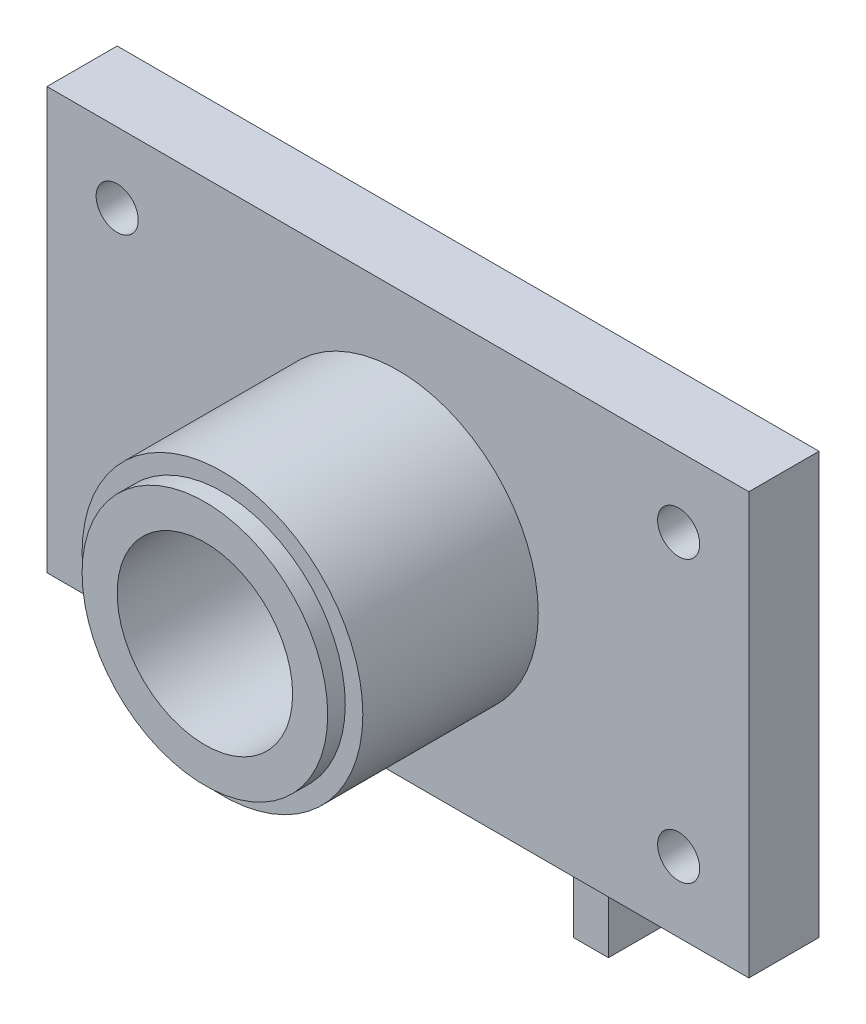
ISO-10303-21;
HEADER;
FILE_DESCRIPTION(('STEP AP214'),'2;1');
FILE_NAME('part.step','',(''),(''),'','','');
FILE_SCHEMA(('AUTOMOTIVE_DESIGN { 1 0 10303 214 1 1 1 1 }'));
ENDSEC;
DATA;
#1=APPLICATION_CONTEXT('core data for automotive mechanical design processes');
#2=APPLICATION_PROTOCOL_DEFINITION('international standard','automotive_design',2000,#1);
#3=PRODUCT_CONTEXT('',#1,'mechanical');
#4=PRODUCT('Part','Part','',(#3));
#5=PRODUCT_RELATED_PRODUCT_CATEGORY('part','',(#4));
#6=PRODUCT_DEFINITION_FORMATION('','',#4);
#7=PRODUCT_DEFINITION_CONTEXT('part definition',#1,'design');
#8=PRODUCT_DEFINITION('design','',#6,#7);
#9=PRODUCT_DEFINITION_SHAPE('','',#8);
#10=(LENGTH_UNIT() NAMED_UNIT(*) SI_UNIT(.MILLI.,.METRE.));
#11=(NAMED_UNIT(*) PLANE_ANGLE_UNIT() SI_UNIT($,.RADIAN.));
#12=(NAMED_UNIT(*) SI_UNIT($,.STERADIAN.) SOLID_ANGLE_UNIT());
#13=UNCERTAINTY_MEASURE_WITH_UNIT(LENGTH_MEASURE(1.E-05),#10,'distance_accuracy_value','');
#14=(GEOMETRIC_REPRESENTATION_CONTEXT(3) GLOBAL_UNCERTAINTY_ASSIGNED_CONTEXT((#13)) GLOBAL_UNIT_ASSIGNED_CONTEXT((#10,
#11,#12)) REPRESENTATION_CONTEXT('',''));
#15=CARTESIAN_POINT('',(0.,0.,0.));
#16=DIRECTION('',(0.,0.,1.));
#17=DIRECTION('',(1.,0.,0.));
#18=AXIS2_PLACEMENT_3D('',#15,#16,#17);
#19=CARTESIAN_POINT('',(0.,0.,20.));
#20=DIRECTION('',(0.,0.,1.));
#21=DIRECTION('',(1.,0.,0.));
#22=AXIS2_PLACEMENT_3D('',#19,#20,#21);
#23=PLANE('',#22);
#24=CARTESIAN_POINT('',(0.,0.,20.));
#25=DIRECTION('',(0.,0.,-1.));
#26=DIRECTION('',(1.,0.,0.));
#27=AXIS2_PLACEMENT_3D('',#24,#25,#26);
#28=CIRCLE('',#27,25.);
#29=CARTESIAN_POINT('',(25.,0.,20.));
#30=VERTEX_POINT('',#29);
#31=EDGE_CURVE('E25',#30,#30,#28,.T.);
#32=ORIENTED_EDGE('',*,*,#31,.F.);
#33=EDGE_LOOP('',(#32));
#34=FACE_BOUND('',#33,.T.);
#35=ADVANCED_FACE('F16',(#34),#23,.T.);
#36=CARTESIAN_POINT('',(0.,0.,0.));
#37=DIRECTION('',(0.,0.,-1.));
#38=DIRECTION('',(1.,0.,0.));
#39=AXIS2_PLACEMENT_3D('',#36,#37,#38);
#40=CYLINDRICAL_SURFACE('',#39,25.);
#41=ORIENTED_EDGE('',*,*,#31,.T.);
#42=DIRECTION('',(0.,0.,1.));
#43=VECTOR('',#42,1.);
#44=CARTESIAN_POINT('',(25.,0.,0.));
#45=LINE('',#44,#43);
#46=CARTESIAN_POINT('',(25.,0.,75.));
#47=VERTEX_POINT('',#46);
#48=EDGE_CURVE('E10',#30,#47,#45,.T.);
#49=ORIENTED_EDGE('',*,*,#48,.T.);
#50=CARTESIAN_POINT('',(0.,0.,75.));
#51=DIRECTION('',(0.,0.,-1.));
#52=DIRECTION('',(1.,0.,0.));
#53=AXIS2_PLACEMENT_3D('',#50,#51,#52);
#54=CIRCLE('',#53,25.);
#55=EDGE_CURVE('E186',#47,#47,#54,.T.);
#56=ORIENTED_EDGE('',*,*,#55,.F.);
#57=ORIENTED_EDGE('',*,*,#48,.F.);
#58=EDGE_LOOP('',(#41,#49,#56,#57));
#59=FACE_BOUND('',#58,.T.);
#60=ADVANCED_FACE('F18',(#59),#40,.F.);
#61=CARTESIAN_POINT('',(0.,0.,75.));
#62=DIRECTION('',(0.,0.,1.));
#63=DIRECTION('',(1.,0.,0.));
#64=AXIS2_PLACEMENT_3D('',#61,#62,#63);
#65=PLANE('',#64);
#66=ORIENTED_EDGE('',*,*,#55,.T.);
#67=EDGE_LOOP('',(#66));
#68=FACE_BOUND('',#67,.T.);
#69=CARTESIAN_POINT('',(0.,0.,75.));
#70=DIRECTION('',(0.,0.,1.));
#71=DIRECTION('',(1.,0.,0.));
#72=AXIS2_PLACEMENT_3D('',#69,#70,#71);
#73=CIRCLE('',#72,35.);
#74=CARTESIAN_POINT('',(35.,0.,75.));
#75=VERTEX_POINT('',#74);
#76=EDGE_CURVE('E180',#75,#75,#73,.T.);
#77=ORIENTED_EDGE('',*,*,#76,.T.);
#78=EDGE_LOOP('',(#77));
#79=FACE_BOUND('',#78,.T.);
#80=ADVANCED_FACE('F581',(#68,#79),#65,.T.);
#81=CARTESIAN_POINT('',(0.,0.,70.));
#82=DIRECTION('',(0.,0.,1.));
#83=DIRECTION('',(1.,0.,0.));
#84=AXIS2_PLACEMENT_3D('',#81,#82,#83);
#85=CYLINDRICAL_SURFACE('',#84,35.);
#86=CARTESIAN_POINT('',(0.,0.,70.));
#87=DIRECTION('',(0.,0.,1.));
#88=DIRECTION('',(1.,0.,0.));
#89=AXIS2_PLACEMENT_3D('',#86,#87,#88);
#90=CIRCLE('',#89,35.);
#91=CARTESIAN_POINT('',(35.,0.,70.));
#92=VERTEX_POINT('',#91);
#93=EDGE_CURVE('E179',#92,#92,#90,.T.);
#94=ORIENTED_EDGE('',*,*,#93,.T.);
#95=DIRECTION('',(0.,0.,1.));
#96=VECTOR('',#95,1.);
#97=CARTESIAN_POINT('',(35.,0.,70.));
#98=LINE('',#97,#96);
#99=EDGE_CURVE('E176',#92,#75,#98,.T.);
#100=ORIENTED_EDGE('',*,*,#99,.T.);
#101=ORIENTED_EDGE('',*,*,#76,.F.);
#102=ORIENTED_EDGE('',*,*,#99,.F.);
#103=EDGE_LOOP('',(#94,#100,#101,#102));
#104=FACE_BOUND('',#103,.T.);
#105=ADVANCED_FACE('F177',(#104),#85,.T.);
#106=CARTESIAN_POINT('',(0.,0.,70.));
#107=DIRECTION('',(0.,0.,1.));
#108=DIRECTION('',(1.,0.,0.));
#109=AXIS2_PLACEMENT_3D('',#106,#107,#108);
#110=PLANE('',#109);
#111=ORIENTED_EDGE('',*,*,#93,.F.);
#112=EDGE_LOOP('',(#111));
#113=FACE_BOUND('',#112,.T.);
#114=CARTESIAN_POINT('',(0.,0.,70.));
#115=DIRECTION('',(0.,0.,-1.));
#116=DIRECTION('',(1.,0.,0.));
#117=AXIS2_PLACEMENT_3D('',#114,#115,#116);
#118=CIRCLE('',#117,40.);
#119=CARTESIAN_POINT('',(40.,0.,70.));
#120=VERTEX_POINT('',#119);
#121=EDGE_CURVE('E189',#120,#120,#118,.T.);
#122=ORIENTED_EDGE('',*,*,#121,.F.);
#123=EDGE_LOOP('',(#122));
#124=FACE_BOUND('',#123,.T.);
#125=ADVANCED_FACE('F742',(#113,#124),#110,.T.);
#126=CARTESIAN_POINT('',(0.,0.,20.));
#127=DIRECTION('',(0.,0.,1.));
#128=DIRECTION('',(1.,0.,0.));
#129=AXIS2_PLACEMENT_3D('',#126,#127,#128);
#130=CYLINDRICAL_SURFACE('',#129,40.);
#131=DIRECTION('',(0.,0.,1.));
#132=VECTOR('',#131,1.);
#133=CARTESIAN_POINT('',(40.,0.,20.));
#134=LINE('',#133,#132);
#135=CARTESIAN_POINT('',(40.,0.,20.));
#136=VERTEX_POINT('',#135);
#137=EDGE_CURVE('E221',#136,#120,#134,.T.);
#138=ORIENTED_EDGE('',*,*,#137,.F.);
#139=CARTESIAN_POINT('',(0.,0.,20.));
#140=DIRECTION('',(0.,0.,-1.));
#141=DIRECTION('',(1.,0.,0.));
#142=AXIS2_PLACEMENT_3D('',#139,#140,#141);
#143=CIRCLE('',#142,40.);
#144=EDGE_CURVE('E213',#136,#136,#143,.T.);
#145=ORIENTED_EDGE('',*,*,#144,.F.);
#146=ORIENTED_EDGE('',*,*,#137,.T.);
#147=ORIENTED_EDGE('',*,*,#121,.T.);
#148=EDGE_LOOP('',(#138,#145,#146,#147));
#149=FACE_BOUND('',#148,.T.);
#150=ADVANCED_FACE('F609',(#149),#130,.T.);
#151=CARTESIAN_POINT('',(0.,0.,20.));
#152=DIRECTION('',(0.,0.,1.));
#153=DIRECTION('',(1.,0.,0.));
#154=AXIS2_PLACEMENT_3D('',#151,#152,#153);
#155=PLANE('',#154);
#156=ORIENTED_EDGE('',*,*,#144,.T.);
#157=EDGE_LOOP('',(#156));
#158=FACE_BOUND('',#157,.T.);
#159=CARTESIAN_POINT('',(80.,40.,20.));
#160=DIRECTION('',(0.,0.,-1.));
#161=DIRECTION('',(1.,0.,0.));
#162=AXIS2_PLACEMENT_3D('',#159,#160,#161);
#163=CIRCLE('',#162,6.);
#164=CARTESIAN_POINT('',(86.,40.,20.));
#165=VERTEX_POINT('',#164);
#166=EDGE_CURVE('E278',#165,#165,#163,.T.);
#167=ORIENTED_EDGE('',*,*,#166,.T.);
#168=EDGE_LOOP('',(#167));
#169=FACE_BOUND('',#168,.T.);
#170=CARTESIAN_POINT('',(-80.,40.,20.));
#171=DIRECTION('',(0.,0.,-1.));
#172=DIRECTION('',(1.,0.,0.));
#173=AXIS2_PLACEMENT_3D('',#170,#171,#172);
#174=CIRCLE('',#173,6.);
#175=CARTESIAN_POINT('',(-74.,40.,20.));
#176=VERTEX_POINT('',#175);
#177=EDGE_CURVE('E274',#176,#176,#174,.T.);
#178=ORIENTED_EDGE('',*,*,#177,.T.);
#179=EDGE_LOOP('',(#178));
#180=FACE_BOUND('',#179,.T.);
#181=CARTESIAN_POINT('',(80.,-40.,20.));
#182=DIRECTION('',(0.,0.,-1.));
#183=DIRECTION('',(1.,0.,0.));
#184=AXIS2_PLACEMENT_3D('',#181,#182,#183);
#185=CIRCLE('',#184,6.);
#186=CARTESIAN_POINT('',(86.,-40.,20.));
#187=VERTEX_POINT('',#186);
#188=EDGE_CURVE('E329',#187,#187,#185,.T.);
#189=ORIENTED_EDGE('',*,*,#188,.T.);
#190=EDGE_LOOP('',(#189));
#191=FACE_BOUND('',#190,.T.);
#192=CARTESIAN_POINT('',(-80.,-40.,20.));
#193=DIRECTION('',(0.,0.,-1.));
#194=DIRECTION('',(1.,0.,0.));
#195=AXIS2_PLACEMENT_3D('',#192,#193,#194);
#196=CIRCLE('',#195,6.);
#197=CARTESIAN_POINT('',(-74.,-40.,20.));
#198=VERTEX_POINT('',#197);
#199=EDGE_CURVE('E270',#198,#198,#196,.T.);
#200=ORIENTED_EDGE('',*,*,#199,.T.);
#201=EDGE_LOOP('',(#200));
#202=FACE_BOUND('',#201,.T.);
#203=DIRECTION('',(1.,0.,0.));
#204=VECTOR('',#203,1.);
#205=CARTESIAN_POINT('',(-100.,-60.,20.));
#206=LINE('',#205,#204);
#207=CARTESIAN_POINT('',(-100.,-60.,20.));
#208=VERTEX_POINT('',#207);
#209=CARTESIAN_POINT('',(100.,-60.,20.));
#210=VERTEX_POINT('',#209);
#211=EDGE_CURVE('E236',#208,#210,#206,.T.);
#212=ORIENTED_EDGE('',*,*,#211,.T.);
#213=DIRECTION('',(0.,1.,0.));
#214=VECTOR('',#213,1.);
#215=CARTESIAN_POINT('',(100.,-60.,20.));
#216=LINE('',#215,#214);
#217=CARTESIAN_POINT('',(100.,60.,20.));
#218=VERTEX_POINT('',#217);
#219=EDGE_CURVE('E408',#210,#218,#216,.T.);
#220=ORIENTED_EDGE('',*,*,#219,.T.);
#221=DIRECTION('',(-1.,0.,0.));
#222=VECTOR('',#221,1.);
#223=CARTESIAN_POINT('',(100.,60.,20.));
#224=LINE('',#223,#222);
#225=CARTESIAN_POINT('',(-100.,60.,20.));
#226=VERTEX_POINT('',#225);
#227=EDGE_CURVE('E263',#218,#226,#224,.T.);
#228=ORIENTED_EDGE('',*,*,#227,.T.);
#229=DIRECTION('',(0.,-1.,0.));
#230=VECTOR('',#229,1.);
#231=CARTESIAN_POINT('',(-100.,60.,20.));
#232=LINE('',#231,#230);
#233=EDGE_CURVE('E244',#226,#208,#232,.T.);
#234=ORIENTED_EDGE('',*,*,#233,.T.);
#235=EDGE_LOOP('',(#212,#220,#228,#234));
#236=FACE_BOUND('',#235,.T.);
#237=ADVANCED_FACE('F541',(#158,#169,#180,#191,#202,#236),#155,.T.);
#238=CARTESIAN_POINT('',(55.,0.,15.));
#239=DIRECTION('',(0.,0.,-1.));
#240=DIRECTION('',(0.,-1.,0.));
#241=AXIS2_PLACEMENT_3D('',#238,#239,#240);
#242=PLANE('',#241);
#243=DIRECTION('',(0.,-1.,0.));
#244=VECTOR('',#243,1.);
#245=CARTESIAN_POINT('',(45.,0.,15.));
#246=LINE('',#245,#244);
#247=CARTESIAN_POINT('',(45.,-60.,15.));
#248=VERTEX_POINT('',#247);
#249=CARTESIAN_POINT('',(45.,-80.,15.));
#250=VERTEX_POINT('',#249);
#251=EDGE_CURVE('E334',#248,#250,#246,.T.);
#252=ORIENTED_EDGE('',*,*,#251,.T.);
#253=DIRECTION('',(-1.,0.,0.));
#254=VECTOR('',#253,1.);
#255=CARTESIAN_POINT('',(55.,-80.,15.));
#256=LINE('',#255,#254);
#257=CARTESIAN_POINT('',(55.,-80.,15.));
#258=VERTEX_POINT('',#257);
#259=EDGE_CURVE('E211',#258,#250,#256,.T.);
#260=ORIENTED_EDGE('',*,*,#259,.F.);
#261=DIRECTION('',(0.,-1.,0.));
#262=VECTOR('',#261,1.);
#263=CARTESIAN_POINT('',(55.,0.,15.));
#264=LINE('',#263,#262);
#265=CARTESIAN_POINT('',(55.,-60.,15.));
#266=VERTEX_POINT('',#265);
#267=EDGE_CURVE('E235',#266,#258,#264,.T.);
#268=ORIENTED_EDGE('',*,*,#267,.F.);
#269=DIRECTION('',(-1.,0.,0.));
#270=VECTOR('',#269,1.);
#271=CARTESIAN_POINT('',(-22.5,-60.,15.));
#272=LINE('',#271,#270);
#273=EDGE_CURVE('E424',#266,#248,#272,.T.);
#274=ORIENTED_EDGE('',*,*,#273,.T.);
#275=EDGE_LOOP('',(#252,#260,#268,#274));
#276=FACE_BOUND('',#275,.T.);
#277=ADVANCED_FACE('F443',(#276),#242,.F.);
#278=CARTESIAN_POINT('',(50.,-80.,0.));
#279=DIRECTION('',(0.,-1.,0.));
#280=DIRECTION('',(0.,0.,-1.));
#281=AXIS2_PLACEMENT_3D('',#278,#279,#280);
#282=PLANE('',#281);
#283=DIRECTION('',(1.,0.,0.));
#284=VECTOR('',#283,1.);
#285=CARTESIAN_POINT('',(45.,-80.,-15.));
#286=LINE('',#285,#284);
#287=CARTESIAN_POINT('',(45.,-80.,-15.));
#288=VERTEX_POINT('',#287);
#289=CARTESIAN_POINT('',(55.,-80.,-15.));
#290=VERTEX_POINT('',#289);
#291=EDGE_CURVE('E208',#288,#290,#286,.T.);
#292=ORIENTED_EDGE('',*,*,#291,.T.);
#293=DIRECTION('',(0.,0.,1.));
#294=VECTOR('',#293,1.);
#295=CARTESIAN_POINT('',(55.,-80.,-15.));
#296=LINE('',#295,#294);
#297=EDGE_CURVE('E240',#290,#258,#296,.T.);
#298=ORIENTED_EDGE('',*,*,#297,.T.);
#299=ORIENTED_EDGE('',*,*,#259,.T.);
#300=DIRECTION('',(0.,0.,-1.));
#301=VECTOR('',#300,1.);
#302=CARTESIAN_POINT('',(45.,-80.,15.));
#303=LINE('',#302,#301);
#304=EDGE_CURVE('E337',#250,#288,#303,.T.);
#305=ORIENTED_EDGE('',*,*,#304,.T.);
#306=EDGE_LOOP('',(#292,#298,#299,#305));
#307=FACE_BOUND('',#306,.T.);
#308=ADVANCED_FACE('F445',(#307),#282,.T.);
#309=CARTESIAN_POINT('',(45.,0.,-15.));
#310=DIRECTION('',(0.,0.,1.));
#311=DIRECTION('',(1.,0.,0.));
#312=AXIS2_PLACEMENT_3D('',#309,#310,#311);
#313=PLANE('',#312);
#314=DIRECTION('',(1.,0.,0.));
#315=VECTOR('',#314,1.);
#316=CARTESIAN_POINT('',(45.,0.,-15.));
#317=LINE('',#316,#315);
#318=CARTESIAN_POINT('',(45.,0.,-15.));
#319=VERTEX_POINT('',#318);
#320=CARTESIAN_POINT('',(55.,0.,-15.));
#321=VERTEX_POINT('',#320);
#322=EDGE_CURVE('E299',#319,#321,#317,.T.);
#323=ORIENTED_EDGE('',*,*,#322,.T.);
#324=DIRECTION('',(0.,-1.,0.));
#325=VECTOR('',#324,1.);
#326=CARTESIAN_POINT('',(55.,0.,-15.));
#327=LINE('',#326,#325);
#328=EDGE_CURVE('E243',#321,#290,#327,.T.);
#329=ORIENTED_EDGE('',*,*,#328,.T.);
#330=ORIENTED_EDGE('',*,*,#291,.F.);
#331=DIRECTION('',(0.,-1.,0.));
#332=VECTOR('',#331,1.);
#333=CARTESIAN_POINT('',(45.,0.,-15.));
#334=LINE('',#333,#332);
#335=EDGE_CURVE('E387',#319,#288,#334,.T.);
#336=ORIENTED_EDGE('',*,*,#335,.F.);
#337=EDGE_LOOP('',(#323,#329,#330,#336));
#338=FACE_BOUND('',#337,.T.);
#339=ADVANCED_FACE('F573',(#338),#313,.F.);
#340=CARTESIAN_POINT('',(-50.,-80.,0.));
#341=DIRECTION('',(0.,-1.,0.));
#342=DIRECTION('',(0.,0.,-1.));
#343=AXIS2_PLACEMENT_3D('',#340,#341,#342);
#344=PLANE('',#343);
#345=DIRECTION('',(1.,0.,0.));
#346=VECTOR('',#345,1.);
#347=CARTESIAN_POINT('',(-55.,-80.,-15.));
#348=LINE('',#347,#346);
#349=CARTESIAN_POINT('',(-55.,-80.,-15.));
#350=VERTEX_POINT('',#349);
#351=CARTESIAN_POINT('',(-45.,-80.,-15.));
#352=VERTEX_POINT('',#351);
#353=EDGE_CURVE('E204',#350,#352,#348,.T.);
#354=ORIENTED_EDGE('',*,*,#353,.T.);
#355=DIRECTION('',(0.,0.,1.));
#356=VECTOR('',#355,1.);
#357=CARTESIAN_POINT('',(-45.,-80.,-15.));
#358=LINE('',#357,#356);
#359=CARTESIAN_POINT('',(-45.,-80.,15.));
#360=VERTEX_POINT('',#359);
#361=EDGE_CURVE('E357',#352,#360,#358,.T.);
#362=ORIENTED_EDGE('',*,*,#361,.T.);
#363=DIRECTION('',(-1.,0.,0.));
#364=VECTOR('',#363,1.);
#365=CARTESIAN_POINT('',(-45.,-80.,15.));
#366=LINE('',#365,#364);
#367=CARTESIAN_POINT('',(-55.,-80.,15.));
#368=VERTEX_POINT('',#367);
#369=EDGE_CURVE('E206',#360,#368,#366,.T.);
#370=ORIENTED_EDGE('',*,*,#369,.T.);
#371=DIRECTION('',(0.,0.,-1.));
#372=VECTOR('',#371,1.);
#373=CARTESIAN_POINT('',(-55.,-80.,15.));
#374=LINE('',#373,#372);
#375=EDGE_CURVE('E256',#368,#350,#374,.T.);
#376=ORIENTED_EDGE('',*,*,#375,.T.);
#377=EDGE_LOOP('',(#354,#362,#370,#376));
#378=FACE_BOUND('',#377,.T.);
#379=ADVANCED_FACE('F560',(#378),#344,.T.);
#380=CARTESIAN_POINT('',(-45.,0.,15.));
#381=DIRECTION('',(0.,0.,-1.));
#382=DIRECTION('',(0.,-1.,0.));
#383=AXIS2_PLACEMENT_3D('',#380,#381,#382);
#384=PLANE('',#383);
#385=DIRECTION('',(0.,-1.,0.));
#386=VECTOR('',#385,1.);
#387=CARTESIAN_POINT('',(-55.,0.,15.));
#388=LINE('',#387,#386);
#389=CARTESIAN_POINT('',(-55.,-60.,15.));
#390=VERTEX_POINT('',#389);
#391=EDGE_CURVE('E248',#390,#368,#388,.T.);
#392=ORIENTED_EDGE('',*,*,#391,.T.);
#393=ORIENTED_EDGE('',*,*,#369,.F.);
#394=DIRECTION('',(0.,-1.,0.));
#395=VECTOR('',#394,1.);
#396=CARTESIAN_POINT('',(-45.,0.,15.));
#397=LINE('',#396,#395);
#398=CARTESIAN_POINT('',(-45.,-60.,15.));
#399=VERTEX_POINT('',#398);
#400=EDGE_CURVE('E362',#399,#360,#397,.T.);
#401=ORIENTED_EDGE('',*,*,#400,.F.);
#402=DIRECTION('',(-1.,0.,0.));
#403=VECTOR('',#402,1.);
#404=CARTESIAN_POINT('',(-72.5,-60.,15.));
#405=LINE('',#404,#403);
#406=EDGE_CURVE('E420',#399,#390,#405,.T.);
#407=ORIENTED_EDGE('',*,*,#406,.T.);
#408=EDGE_LOOP('',(#392,#393,#401,#407));
#409=FACE_BOUND('',#408,.T.);
#410=ADVANCED_FACE('F563',(#409),#384,.F.);
#411=CARTESIAN_POINT('',(-55.,0.,-15.));
#412=DIRECTION('',(0.,0.,1.));
#413=DIRECTION('',(1.,0.,0.));
#414=AXIS2_PLACEMENT_3D('',#411,#412,#413);
#415=PLANE('',#414);
#416=DIRECTION('',(1.,0.,0.));
#417=VECTOR('',#416,1.);
#418=CARTESIAN_POINT('',(-55.,0.,-15.));
#419=LINE('',#418,#417);
#420=CARTESIAN_POINT('',(-55.,0.,-15.));
#421=VERTEX_POINT('',#420);
#422=CARTESIAN_POINT('',(-45.,0.,-15.));
#423=VERTEX_POINT('',#422);
#424=EDGE_CURVE('E356',#421,#423,#419,.T.);
#425=ORIENTED_EDGE('',*,*,#424,.T.);
#426=DIRECTION('',(0.,-1.,0.));
#427=VECTOR('',#426,1.);
#428=CARTESIAN_POINT('',(-45.,0.,-15.));
#429=LINE('',#428,#427);
#430=EDGE_CURVE('E361',#423,#352,#429,.T.);
#431=ORIENTED_EDGE('',*,*,#430,.T.);
#432=ORIENTED_EDGE('',*,*,#353,.F.);
#433=DIRECTION('',(0.,-1.,0.));
#434=VECTOR('',#433,1.);
#435=CARTESIAN_POINT('',(-55.,0.,-15.));
#436=LINE('',#435,#434);
#437=EDGE_CURVE('E252',#421,#350,#436,.T.);
#438=ORIENTED_EDGE('',*,*,#437,.F.);
#439=EDGE_LOOP('',(#425,#431,#432,#438));
#440=FACE_BOUND('',#439,.T.);
#441=ADVANCED_FACE('F557',(#440),#415,.F.);
#442=CARTESIAN_POINT('',(80.,40.,0.));
#443=DIRECTION('',(0.,0.,-1.));
#444=DIRECTION('',(1.,0.,0.));
#445=AXIS2_PLACEMENT_3D('',#442,#443,#444);
#446=CYLINDRICAL_SURFACE('',#445,6.);
#447=CARTESIAN_POINT('',(80.,40.,0.));
#448=DIRECTION('',(0.,0.,1.));
#449=DIRECTION('',(1.,0.,0.));
#450=AXIS2_PLACEMENT_3D('',#447,#448,#449);
#451=CIRCLE('',#450,6.);
#452=CARTESIAN_POINT('',(86.,40.,0.));
#453=VERTEX_POINT('',#452);
#454=EDGE_CURVE('E333',#453,#453,#451,.T.);
#455=ORIENTED_EDGE('',*,*,#454,.F.);
#456=DIRECTION('',(0.,0.,1.));
#457=VECTOR('',#456,1.);
#458=CARTESIAN_POINT('',(86.,40.,0.));
#459=LINE('',#458,#457);
#460=EDGE_CURVE('E276',#453,#165,#459,.T.);
#461=ORIENTED_EDGE('',*,*,#460,.T.);
#462=ORIENTED_EDGE('',*,*,#166,.F.);
#463=ORIENTED_EDGE('',*,*,#460,.F.);
#464=EDGE_LOOP('',(#455,#461,#462,#463));
#465=FACE_BOUND('',#464,.T.);
#466=ADVANCED_FACE('F571',(#465),#446,.F.);
#467=CARTESIAN_POINT('',(-80.,40.,0.));
#468=DIRECTION('',(0.,0.,-1.));
#469=DIRECTION('',(1.,0.,0.));
#470=AXIS2_PLACEMENT_3D('',#467,#468,#469);
#471=CYLINDRICAL_SURFACE('',#470,6.);
#472=CARTESIAN_POINT('',(-80.,40.,0.));
#473=DIRECTION('',(0.,0.,1.));
#474=DIRECTION('',(1.,0.,0.));
#475=AXIS2_PLACEMENT_3D('',#472,#473,#474);
#476=CIRCLE('',#475,6.);
#477=CARTESIAN_POINT('',(-74.,40.,0.));
#478=VERTEX_POINT('',#477);
#479=EDGE_CURVE('E342',#478,#478,#476,.T.);
#480=ORIENTED_EDGE('',*,*,#479,.F.);
#481=DIRECTION('',(0.,0.,1.));
#482=VECTOR('',#481,1.);
#483=CARTESIAN_POINT('',(-74.,40.,0.));
#484=LINE('',#483,#482);
#485=EDGE_CURVE('E277',#478,#176,#484,.T.);
#486=ORIENTED_EDGE('',*,*,#485,.T.);
#487=ORIENTED_EDGE('',*,*,#177,.F.);
#488=ORIENTED_EDGE('',*,*,#485,.F.);
#489=EDGE_LOOP('',(#480,#486,#487,#488));
#490=FACE_BOUND('',#489,.T.);
#491=ADVANCED_FACE('F585',(#490),#471,.F.);
#492=CARTESIAN_POINT('',(80.,-40.,0.));
#493=DIRECTION('',(0.,0.,-1.));
#494=DIRECTION('',(1.,0.,0.));
#495=AXIS2_PLACEMENT_3D('',#492,#493,#494);
#496=CYLINDRICAL_SURFACE('',#495,6.);
#497=CARTESIAN_POINT('',(80.,-40.,0.));
#498=DIRECTION('',(0.,0.,1.));
#499=DIRECTION('',(1.,0.,0.));
#500=AXIS2_PLACEMENT_3D('',#497,#498,#499);
#501=CIRCLE('',#500,6.);
#502=CARTESIAN_POINT('',(86.,-40.,0.));
#503=VERTEX_POINT('',#502);
#504=EDGE_CURVE('E338',#503,#503,#501,.T.);
#505=ORIENTED_EDGE('',*,*,#504,.F.);
#506=DIRECTION('',(0.,0.,1.));
#507=VECTOR('',#506,1.);
#508=CARTESIAN_POINT('',(86.,-40.,0.));
#509=LINE('',#508,#507);
#510=EDGE_CURVE('E273',#503,#187,#509,.T.);
#511=ORIENTED_EDGE('',*,*,#510,.T.);
#512=ORIENTED_EDGE('',*,*,#188,.F.);
#513=ORIENTED_EDGE('',*,*,#510,.F.);
#514=EDGE_LOOP('',(#505,#511,#512,#513));
#515=FACE_BOUND('',#514,.T.);
#516=ADVANCED_FACE('F588',(#515),#496,.F.);
#517=CARTESIAN_POINT('',(-80.,-40.,0.));
#518=DIRECTION('',(0.,0.,-1.));
#519=DIRECTION('',(1.,0.,0.));
#520=AXIS2_PLACEMENT_3D('',#517,#518,#519);
#521=CYLINDRICAL_SURFACE('',#520,6.);
#522=CARTESIAN_POINT('',(-80.,-40.,0.));
#523=DIRECTION('',(0.,0.,1.));
#524=DIRECTION('',(1.,0.,0.));
#525=AXIS2_PLACEMENT_3D('',#522,#523,#524);
#526=CIRCLE('',#525,6.);
#527=CARTESIAN_POINT('',(-74.,-40.,0.));
#528=VERTEX_POINT('',#527);
#529=EDGE_CURVE('E343',#528,#528,#526,.T.);
#530=ORIENTED_EDGE('',*,*,#529,.F.);
#531=DIRECTION('',(0.,0.,1.));
#532=VECTOR('',#531,1.);
#533=CARTESIAN_POINT('',(-74.,-40.,0.));
#534=LINE('',#533,#532);
#535=EDGE_CURVE('E266',#528,#198,#534,.T.);
#536=ORIENTED_EDGE('',*,*,#535,.T.);
#537=ORIENTED_EDGE('',*,*,#199,.F.);
#538=ORIENTED_EDGE('',*,*,#535,.F.);
#539=EDGE_LOOP('',(#530,#536,#537,#538));
#540=FACE_BOUND('',#539,.T.);
#541=ADVANCED_FACE('F592',(#540),#521,.F.);
#542=CARTESIAN_POINT('',(100.,60.,0.));
#543=DIRECTION('',(0.,-1.,0.));
#544=DIRECTION('',(0.,0.,-1.));
#545=AXIS2_PLACEMENT_3D('',#542,#543,#544);
#546=PLANE('',#545);
#547=DIRECTION('',(-1.,0.,0.));
#548=VECTOR('',#547,1.);
#549=CARTESIAN_POINT('',(100.,60.,0.));
#550=LINE('',#549,#548);
#551=CARTESIAN_POINT('',(100.,60.,0.));
#552=VERTEX_POINT('',#551);
#553=CARTESIAN_POINT('',(-100.,60.,0.));
#554=VERTEX_POINT('',#553);
#555=EDGE_CURVE('E490',#552,#554,#550,.T.);
#556=ORIENTED_EDGE('',*,*,#555,.T.);
#557=DIRECTION('',(0.,0.,1.));
#558=VECTOR('',#557,1.);
#559=CARTESIAN_POINT('',(-100.,60.,0.));
#560=LINE('',#559,#558);
#561=EDGE_CURVE('E247',#554,#226,#560,.T.);
#562=ORIENTED_EDGE('',*,*,#561,.T.);
#563=ORIENTED_EDGE('',*,*,#227,.F.);
#564=DIRECTION('',(0.,0.,1.));
#565=VECTOR('',#564,1.);
#566=CARTESIAN_POINT('',(100.,60.,0.));
#567=LINE('',#566,#565);
#568=EDGE_CURVE('E402',#552,#218,#567,.T.);
#569=ORIENTED_EDGE('',*,*,#568,.F.);
#570=EDGE_LOOP('',(#556,#562,#563,#569));
#571=FACE_BOUND('',#570,.T.);
#572=ADVANCED_FACE('F488',(#571),#546,.F.);
#573=CARTESIAN_POINT('',(-100.,60.,0.));
#574=DIRECTION('',(1.,0.,0.));
#575=DIRECTION('',(0.,1.,0.));
#576=AXIS2_PLACEMENT_3D('',#573,#574,#575);
#577=PLANE('',#576);
#578=DIRECTION('',(0.,-1.,0.));
#579=VECTOR('',#578,1.);
#580=CARTESIAN_POINT('',(-100.,60.,0.));
#581=LINE('',#580,#579);
#582=CARTESIAN_POINT('',(-100.,-60.,0.));
#583=VERTEX_POINT('',#582);
#584=EDGE_CURVE('E501',#554,#583,#581,.T.);
#585=ORIENTED_EDGE('',*,*,#584,.T.);
#586=DIRECTION('',(0.,0.,1.));
#587=VECTOR('',#586,1.);
#588=CARTESIAN_POINT('',(-100.,-60.,0.));
#589=LINE('',#588,#587);
#590=EDGE_CURVE('E232',#583,#208,#589,.T.);
#591=ORIENTED_EDGE('',*,*,#590,.T.);
#592=ORIENTED_EDGE('',*,*,#233,.F.);
#593=ORIENTED_EDGE('',*,*,#561,.F.);
#594=EDGE_LOOP('',(#585,#591,#592,#593));
#595=FACE_BOUND('',#594,.T.);
#596=ADVANCED_FACE('F539',(#595),#577,.F.);
#597=CARTESIAN_POINT('',(-55.,0.,15.));
#598=DIRECTION('',(1.,0.,0.));
#599=DIRECTION('',(0.,1.,0.));
#600=AXIS2_PLACEMENT_3D('',#597,#598,#599);
#601=PLANE('',#600);
#602=DIRECTION('',(0.,1.,0.));
#603=VECTOR('',#602,1.);
#604=CARTESIAN_POINT('',(-55.,0.,0.));
#605=LINE('',#604,#603);
#606=CARTESIAN_POINT('',(-55.,-60.,0.));
#607=VERTEX_POINT('',#606);
#608=CARTESIAN_POINT('',(-55.,0.,0.));
#609=VERTEX_POINT('',#608);
#610=EDGE_CURVE('E514',#607,#609,#605,.T.);
#611=ORIENTED_EDGE('',*,*,#610,.T.);
#612=DIRECTION('',(0.,0.,-1.));
#613=VECTOR('',#612,1.);
#614=CARTESIAN_POINT('',(-55.,0.,15.));
#615=LINE('',#614,#613);
#616=EDGE_CURVE('E366',#609,#421,#615,.T.);
#617=ORIENTED_EDGE('',*,*,#616,.T.);
#618=ORIENTED_EDGE('',*,*,#437,.T.);
#619=ORIENTED_EDGE('',*,*,#375,.F.);
#620=ORIENTED_EDGE('',*,*,#391,.F.);
#621=DIRECTION('',(0.,0.,-1.));
#622=VECTOR('',#621,1.);
#623=CARTESIAN_POINT('',(-55.,-60.,7.5));
#624=LINE('',#623,#622);
#625=EDGE_CURVE('E416',#390,#607,#624,.T.);
#626=ORIENTED_EDGE('',*,*,#625,.T.);
#627=EDGE_LOOP('',(#611,#617,#618,#619,#620,#626));
#628=FACE_BOUND('',#627,.T.);
#629=ADVANCED_FACE('F520',(#628),#601,.F.);
#630=CARTESIAN_POINT('',(55.,0.,-15.));
#631=DIRECTION('',(-1.,0.,0.));
#632=DIRECTION('',(0.,0.,1.));
#633=AXIS2_PLACEMENT_3D('',#630,#631,#632);
#634=PLANE('',#633);
#635=DIRECTION('',(0.,-1.,0.));
#636=VECTOR('',#635,1.);
#637=CARTESIAN_POINT('',(55.,0.,0.));
#638=LINE('',#637,#636);
#639=CARTESIAN_POINT('',(55.,0.,0.));
#640=VERTEX_POINT('',#639);
#641=CARTESIAN_POINT('',(55.,-60.,0.));
#642=VERTEX_POINT('',#641);
#643=EDGE_CURVE('E305',#640,#642,#638,.T.);
#644=ORIENTED_EDGE('',*,*,#643,.T.);
#645=DIRECTION('',(0.,0.,1.));
#646=VECTOR('',#645,1.);
#647=CARTESIAN_POINT('',(55.,-60.,-7.5));
#648=LINE('',#647,#646);
#649=EDGE_CURVE('E373',#642,#266,#648,.T.);
#650=ORIENTED_EDGE('',*,*,#649,.T.);
#651=ORIENTED_EDGE('',*,*,#267,.T.);
#652=ORIENTED_EDGE('',*,*,#297,.F.);
#653=ORIENTED_EDGE('',*,*,#328,.F.);
#654=DIRECTION('',(0.,0.,1.));
#655=VECTOR('',#654,1.);
#656=CARTESIAN_POINT('',(55.,0.,-15.));
#657=LINE('',#656,#655);
#658=EDGE_CURVE('E296',#321,#640,#657,.T.);
#659=ORIENTED_EDGE('',*,*,#658,.T.);
#660=EDGE_LOOP('',(#644,#650,#651,#652,#653,#659));
#661=FACE_BOUND('',#660,.T.);
#662=ADVANCED_FACE('F432',(#661),#634,.F.);
#663=CARTESIAN_POINT('',(-100.,-60.,0.));
#664=DIRECTION('',(0.,1.,0.));
#665=DIRECTION('',(1.,0.,0.));
#666=AXIS2_PLACEMENT_3D('',#663,#664,#665);
#667=PLANE('',#666);
#668=ORIENTED_EDGE('',*,*,#625,.F.);
#669=ORIENTED_EDGE('',*,*,#406,.F.);
#670=DIRECTION('',(0.,0.,1.));
#671=VECTOR('',#670,1.);
#672=CARTESIAN_POINT('',(-45.,-60.,-7.5));
#673=LINE('',#672,#671);
#674=CARTESIAN_POINT('',(-45.,-60.,0.));
#675=VERTEX_POINT('',#674);
#676=EDGE_CURVE('E370',#675,#399,#673,.T.);
#677=ORIENTED_EDGE('',*,*,#676,.F.);
#678=DIRECTION('',(1.,0.,0.));
#679=VECTOR('',#678,1.);
#680=CARTESIAN_POINT('',(-100.,-60.,0.));
#681=LINE('',#680,#679);
#682=CARTESIAN_POINT('',(45.,-60.,0.));
#683=VERTEX_POINT('',#682);
#684=EDGE_CURVE('E314',#675,#683,#681,.T.);
#685=ORIENTED_EDGE('',*,*,#684,.T.);
#686=DIRECTION('',(0.,0.,-1.));
#687=VECTOR('',#686,1.);
#688=CARTESIAN_POINT('',(45.,-60.,7.5));
#689=LINE('',#688,#687);
#690=EDGE_CURVE('E300',#248,#683,#689,.T.);
#691=ORIENTED_EDGE('',*,*,#690,.F.);
#692=ORIENTED_EDGE('',*,*,#273,.F.);
#693=ORIENTED_EDGE('',*,*,#649,.F.);
#694=DIRECTION('',(1.,0.,0.));
#695=VECTOR('',#694,1.);
#696=CARTESIAN_POINT('',(-100.,-60.,0.));
#697=LINE('',#696,#695);
#698=CARTESIAN_POINT('',(100.,-60.,0.));
#699=VERTEX_POINT('',#698);
#700=EDGE_CURVE('E301',#642,#699,#697,.T.);
#701=ORIENTED_EDGE('',*,*,#700,.T.);
#702=DIRECTION('',(0.,0.,1.));
#703=VECTOR('',#702,1.);
#704=CARTESIAN_POINT('',(100.,-60.,0.));
#705=LINE('',#704,#703);
#706=EDGE_CURVE('E412',#699,#210,#705,.T.);
#707=ORIENTED_EDGE('',*,*,#706,.T.);
#708=ORIENTED_EDGE('',*,*,#211,.F.);
#709=ORIENTED_EDGE('',*,*,#590,.F.);
#710=DIRECTION('',(1.,0.,0.));
#711=VECTOR('',#710,1.);
#712=CARTESIAN_POINT('',(-100.,-60.,0.));
#713=LINE('',#712,#711);
#714=EDGE_CURVE('E506',#583,#607,#713,.T.);
#715=ORIENTED_EDGE('',*,*,#714,.T.);
#716=EDGE_LOOP('',(#668,#669,#677,#685,#691,#692,#693,#701,#707,#708,#709,#715));
#717=FACE_BOUND('',#716,.T.);
#718=ADVANCED_FACE('F440',(#717),#667,.F.);
#719=CARTESIAN_POINT('',(100.,-60.,0.));
#720=DIRECTION('',(-1.,0.,0.));
#721=DIRECTION('',(0.,0.,1.));
#722=AXIS2_PLACEMENT_3D('',#719,#720,#721);
#723=PLANE('',#722);
#724=DIRECTION('',(0.,1.,0.));
#725=VECTOR('',#724,1.);
#726=CARTESIAN_POINT('',(100.,-60.,0.));
#727=LINE('',#726,#725);
#728=EDGE_CURVE('E294',#699,#552,#727,.T.);
#729=ORIENTED_EDGE('',*,*,#728,.T.);
#730=ORIENTED_EDGE('',*,*,#568,.T.);
#731=ORIENTED_EDGE('',*,*,#219,.F.);
#732=ORIENTED_EDGE('',*,*,#706,.F.);
#733=EDGE_LOOP('',(#729,#730,#731,#732));
#734=FACE_BOUND('',#733,.T.);
#735=ADVANCED_FACE('F495',(#734),#723,.F.);
#736=CARTESIAN_POINT('',(50.,0.,0.));
#737=DIRECTION('',(0.,-1.,0.));
#738=DIRECTION('',(0.,0.,-1.));
#739=AXIS2_PLACEMENT_3D('',#736,#737,#738);
#740=PLANE('',#739);
#741=DIRECTION('',(-1.,0.,0.));
#742=VECTOR('',#741,1.);
#743=CARTESIAN_POINT('',(55.,0.,0.));
#744=LINE('',#743,#742);
#745=CARTESIAN_POINT('',(45.,0.,0.));
#746=VERTEX_POINT('',#745);
#747=EDGE_CURVE('E309',#640,#746,#744,.T.);
#748=ORIENTED_EDGE('',*,*,#747,.F.);
#749=ORIENTED_EDGE('',*,*,#658,.F.);
#750=ORIENTED_EDGE('',*,*,#322,.F.);
#751=DIRECTION('',(0.,0.,-1.));
#752=VECTOR('',#751,1.);
#753=CARTESIAN_POINT('',(45.,0.,15.));
#754=LINE('',#753,#752);
#755=EDGE_CURVE('E383',#746,#319,#754,.T.);
#756=ORIENTED_EDGE('',*,*,#755,.F.);
#757=EDGE_LOOP('',(#748,#749,#750,#756));
#758=FACE_BOUND('',#757,.T.);
#759=ADVANCED_FACE('F545',(#758),#740,.F.);
#760=CARTESIAN_POINT('',(45.,0.,15.));
#761=DIRECTION('',(1.,0.,0.));
#762=DIRECTION('',(0.,1.,0.));
#763=AXIS2_PLACEMENT_3D('',#760,#761,#762);
#764=PLANE('',#763);
#765=DIRECTION('',(0.,-1.,0.));
#766=VECTOR('',#765,1.);
#767=CARTESIAN_POINT('',(45.,0.,0.));
#768=LINE('',#767,#766);
#769=EDGE_CURVE('E313',#746,#683,#768,.T.);
#770=ORIENTED_EDGE('',*,*,#769,.F.);
#771=ORIENTED_EDGE('',*,*,#755,.T.);
#772=ORIENTED_EDGE('',*,*,#335,.T.);
#773=ORIENTED_EDGE('',*,*,#304,.F.);
#774=ORIENTED_EDGE('',*,*,#251,.F.);
#775=ORIENTED_EDGE('',*,*,#690,.T.);
#776=EDGE_LOOP('',(#770,#771,#772,#773,#774,#775));
#777=FACE_BOUND('',#776,.T.);
#778=ADVANCED_FACE('F548',(#777),#764,.F.);
#779=CARTESIAN_POINT('',(-45.,0.,-15.));
#780=DIRECTION('',(-1.,0.,0.));
#781=DIRECTION('',(0.,0.,1.));
#782=AXIS2_PLACEMENT_3D('',#779,#780,#781);
#783=PLANE('',#782);
#784=DIRECTION('',(0.,1.,0.));
#785=VECTOR('',#784,1.);
#786=CARTESIAN_POINT('',(-45.,-60.,0.));
#787=LINE('',#786,#785);
#788=CARTESIAN_POINT('',(-45.,0.,0.));
#789=VERTEX_POINT('',#788);
#790=EDGE_CURVE('E318',#675,#789,#787,.T.);
#791=ORIENTED_EDGE('',*,*,#790,.F.);
#792=ORIENTED_EDGE('',*,*,#676,.T.);
#793=ORIENTED_EDGE('',*,*,#400,.T.);
#794=ORIENTED_EDGE('',*,*,#361,.F.);
#795=ORIENTED_EDGE('',*,*,#430,.F.);
#796=DIRECTION('',(0.,0.,1.));
#797=VECTOR('',#796,1.);
#798=CARTESIAN_POINT('',(-45.,0.,-15.));
#799=LINE('',#798,#797);
#800=EDGE_CURVE('E353',#423,#789,#799,.T.);
#801=ORIENTED_EDGE('',*,*,#800,.T.);
#802=EDGE_LOOP('',(#791,#792,#793,#794,#795,#801));
#803=FACE_BOUND('',#802,.T.);
#804=ADVANCED_FACE('F551',(#803),#783,.F.);
#805=CARTESIAN_POINT('',(-50.,0.,0.));
#806=DIRECTION('',(0.,-1.,0.));
#807=DIRECTION('',(0.,0.,-1.));
#808=AXIS2_PLACEMENT_3D('',#805,#806,#807);
#809=PLANE('',#808);
#810=DIRECTION('',(-1.,0.,0.));
#811=VECTOR('',#810,1.);
#812=CARTESIAN_POINT('',(-45.,0.,0.));
#813=LINE('',#812,#811);
#814=EDGE_CURVE('E325',#789,#609,#813,.T.);
#815=ORIENTED_EDGE('',*,*,#814,.F.);
#816=ORIENTED_EDGE('',*,*,#800,.F.);
#817=ORIENTED_EDGE('',*,*,#424,.F.);
#818=ORIENTED_EDGE('',*,*,#616,.F.);
#819=EDGE_LOOP('',(#815,#816,#817,#818));
#820=FACE_BOUND('',#819,.T.);
#821=ADVANCED_FACE('F555',(#820),#809,.F.);
#822=CARTESIAN_POINT('',(0.,0.,0.));
#823=DIRECTION('',(0.,0.,1.));
#824=DIRECTION('',(1.,0.,0.));
#825=AXIS2_PLACEMENT_3D('',#822,#823,#824);
#826=PLANE('',#825);
#827=ORIENTED_EDGE('',*,*,#479,.T.);
#828=EDGE_LOOP('',(#827));
#829=FACE_BOUND('',#828,.T.);
#830=ORIENTED_EDGE('',*,*,#504,.T.);
#831=EDGE_LOOP('',(#830));
#832=FACE_BOUND('',#831,.T.);
#833=ORIENTED_EDGE('',*,*,#529,.T.);
#834=EDGE_LOOP('',(#833));
#835=FACE_BOUND('',#834,.T.);
#836=ORIENTED_EDGE('',*,*,#454,.T.);
#837=EDGE_LOOP('',(#836));
#838=FACE_BOUND('',#837,.T.);
#839=ORIENTED_EDGE('',*,*,#610,.F.);
#840=ORIENTED_EDGE('',*,*,#714,.F.);
#841=ORIENTED_EDGE('',*,*,#584,.F.);
#842=ORIENTED_EDGE('',*,*,#555,.F.);
#843=ORIENTED_EDGE('',*,*,#728,.F.);
#844=ORIENTED_EDGE('',*,*,#700,.F.);
#845=ORIENTED_EDGE('',*,*,#643,.F.);
#846=ORIENTED_EDGE('',*,*,#747,.T.);
#847=ORIENTED_EDGE('',*,*,#769,.T.);
#848=ORIENTED_EDGE('',*,*,#684,.F.);
#849=ORIENTED_EDGE('',*,*,#790,.T.);
#850=ORIENTED_EDGE('',*,*,#814,.T.);
#851=EDGE_LOOP('',(#839,#840,#841,#842,#843,#844,#845,#846,#847,#848,#849,#850));
#852=FACE_BOUND('',#851,.T.);
#853=ADVANCED_FACE('F498',(#829,#832,#835,#838,#852),#826,.F.);
#854=CLOSED_SHELL('',(#35,#60,#80,#105,#125,#150,#237,#277,#308,#339,#379,#410,#441,#466,#491,
#516,#541,#572,#596,#629,#662,#718,#735,#759,#778,#804,#821,#853));
#855=MANIFOLD_SOLID_BREP('B1',#854);
#856=ADVANCED_BREP_SHAPE_REPRESENTATION('',(#18,#855),#14);
#857=SHAPE_DEFINITION_REPRESENTATION(#9,#856);
ENDSEC;
END-ISO-10303-21;
